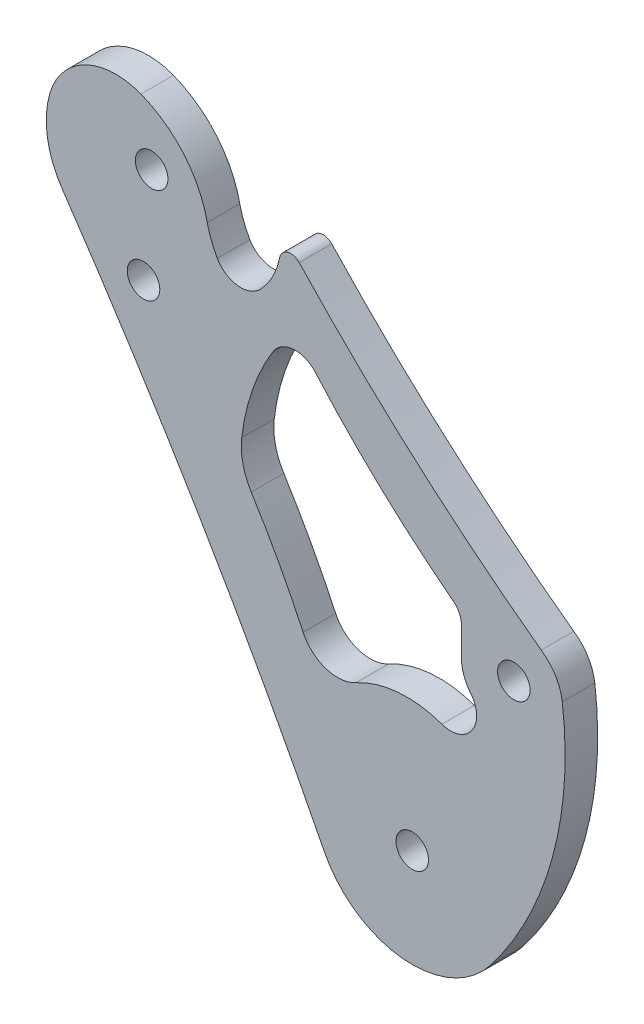
ISO-10303-21;
HEADER;
FILE_DESCRIPTION(('STEP AP214'),'2;1');
FILE_NAME('part.step','',(''),(''),'','','');
FILE_SCHEMA(('AUTOMOTIVE_DESIGN { 1 0 10303 214 1 1 1 1 }'));
ENDSEC;
DATA;
#1=APPLICATION_CONTEXT('core data for automotive mechanical design processes');
#2=APPLICATION_PROTOCOL_DEFINITION('international standard','automotive_design',2000,#1);
#3=PRODUCT_CONTEXT('',#1,'mechanical');
#4=PRODUCT('Part','Part','',(#3));
#5=PRODUCT_RELATED_PRODUCT_CATEGORY('part','',(#4));
#6=PRODUCT_DEFINITION_FORMATION('','',#4);
#7=PRODUCT_DEFINITION_CONTEXT('part definition',#1,'design');
#8=PRODUCT_DEFINITION('design','',#6,#7);
#9=PRODUCT_DEFINITION_SHAPE('','',#8);
#10=(LENGTH_UNIT() NAMED_UNIT(*) SI_UNIT(.MILLI.,.METRE.));
#11=(NAMED_UNIT(*) PLANE_ANGLE_UNIT() SI_UNIT($,.RADIAN.));
#12=(NAMED_UNIT(*) SI_UNIT($,.STERADIAN.) SOLID_ANGLE_UNIT());
#13=UNCERTAINTY_MEASURE_WITH_UNIT(LENGTH_MEASURE(1.E-05),#10,'distance_accuracy_value','');
#14=(GEOMETRIC_REPRESENTATION_CONTEXT(3) GLOBAL_UNCERTAINTY_ASSIGNED_CONTEXT((#13)) GLOBAL_UNIT_ASSIGNED_CONTEXT((#10,
#11,#12)) REPRESENTATION_CONTEXT('',''));
#15=CARTESIAN_POINT('',(0.,0.,0.));
#16=DIRECTION('',(0.,0.,1.));
#17=DIRECTION('',(1.,0.,0.));
#18=AXIS2_PLACEMENT_3D('',#15,#16,#17);
#19=CARTESIAN_POINT('',(65.9573973429245,54.9204086628335,3.));
#20=DIRECTION('',(0.,0.,-1.));
#21=DIRECTION('',(-1.,0.,0.));
#22=AXIS2_PLACEMENT_3D('',#19,#20,#21);
#23=PLANE('',#22);
#24=CARTESIAN_POINT('',(67.5354671080567,46.360427952564,3.));
#25=DIRECTION('',(0.,0.,1.));
#26=DIRECTION('',(1.,0.,0.));
#27=AXIS2_PLACEMENT_3D('',#24,#25,#26);
#28=CIRCLE('',#27,1.50110642000384);
#29=CARTESIAN_POINT('',(69.0365735280606,46.360427952564,3.));
#30=VERTEX_POINT('',#29);
#31=EDGE_CURVE('E282',#30,#30,#28,.T.);
#32=ORIENTED_EDGE('',*,*,#31,.F.);
#33=EDGE_LOOP('',(#32));
#34=FACE_BOUND('',#33,.T.);
#35=CARTESIAN_POINT('',(92.3123714532048,13.2000942948942,3.));
#36=DIRECTION('',(0.,0.,1.));
#37=DIRECTION('',(1.,0.,0.));
#38=AXIS2_PLACEMENT_3D('',#35,#36,#37);
#39=CIRCLE('',#38,1.5);
#40=CARTESIAN_POINT('',(93.8123714532048,13.2000942948942,3.));
#41=VERTEX_POINT('',#40);
#42=EDGE_CURVE('E288',#41,#41,#39,.T.);
#43=ORIENTED_EDGE('',*,*,#42,.F.);
#44=EDGE_LOOP('',(#43));
#45=FACE_BOUND('',#44,.T.);
#46=CARTESIAN_POINT('',(101.682075095834,31.4335430539551,3.));
#47=DIRECTION('',(0.,0.,1.));
#48=DIRECTION('',(1.,0.,0.));
#49=AXIS2_PLACEMENT_3D('',#46,#47,#48);
#50=CIRCLE('',#49,1.5);
#51=CARTESIAN_POINT('',(103.182075095834,31.4335430539551,3.));
#52=VERTEX_POINT('',#51);
#53=EDGE_CURVE('E294',#52,#52,#50,.T.);
#54=ORIENTED_EDGE('',*,*,#53,.F.);
#55=EDGE_LOOP('',(#54));
#56=FACE_BOUND('',#55,.T.);
#57=CARTESIAN_POINT('',(68.2854671080567,55.560427952564,3.));
#58=DIRECTION('',(0.,0.,1.));
#59=DIRECTION('',(1.,0.,0.));
#60=AXIS2_PLACEMENT_3D('',#57,#58,#59);
#61=CIRCLE('',#60,1.5);
#62=CARTESIAN_POINT('',(69.7854671080567,55.560427952564,3.));
#63=VERTEX_POINT('',#62);
#64=EDGE_CURVE('E300',#63,#63,#61,.T.);
#65=ORIENTED_EDGE('',*,*,#64,.F.);
#66=EDGE_LOOP('',(#65));
#67=FACE_BOUND('',#66,.T.);
#68=CARTESIAN_POINT('',(66.9297595318174,54.6414005412217,3.));
#69=DIRECTION('',(0.,0.,1.));
#70=DIRECTION('',(-1.,0.,0.));
#71=AXIS2_PLACEMENT_3D('',#68,#69,#70);
#72=CIRCLE('',#71,8.36216252942286);
#73=CARTESIAN_POINT('',(58.8919443420734,56.9477589574275,3.));
#74=VERTEX_POINT('',#73);
#75=CARTESIAN_POINT('',(60.0269446482824,49.9215585044443,3.));
#76=VERTEX_POINT('',#75);
#77=EDGE_CURVE('E306',#74,#76,#72,.T.);
#78=ORIENTED_EDGE('',*,*,#77,.T.);
#79=CARTESIAN_POINT('',(-239.950657402607,-155.189967755456,3.));
#80=DIRECTION('',(0.,0.,-1.));
#81=DIRECTION('',(-1.,0.,0.));
#82=AXIS2_PLACEMENT_3D('',#79,#80,#81);
#83=CIRCLE('',#82,363.396890378643);
#84=CARTESIAN_POINT('',(84.1952739936411,9.086369847153,3.));
#85=VERTEX_POINT('',#84);
#86=EDGE_CURVE('E309',#76,#85,#83,.T.);
#87=ORIENTED_EDGE('',*,*,#86,.T.);
#88=CARTESIAN_POINT('',(92.3123714532048,13.2000942948942,3.));
#89=DIRECTION('',(0.,0.,1.));
#90=DIRECTION('',(1.,0.,0.));
#91=AXIS2_PLACEMENT_3D('',#88,#89,#90);
#92=CIRCLE('',#91,9.09999999999997);
#93=CARTESIAN_POINT('',(99.5090678289681,7.63075310629086,3.));
#94=VERTEX_POINT('',#93);
#95=EDGE_CURVE('E312',#85,#94,#92,.T.);
#96=ORIENTED_EDGE('',*,*,#95,.T.);
#97=CARTESIAN_POINT('',(73.4111578948811,27.8272651089185,3.));
#98=DIRECTION('',(0.,0.,1.));
#99=DIRECTION('',(1.,0.,0.));
#100=AXIS2_PLACEMENT_3D('',#97,#98,#99);
#101=CIRCLE('',#100,33.);
#102=CARTESIAN_POINT('',(106.145904127564,32.0029553610661,3.));
#103=VERTEX_POINT('',#102);
#104=EDGE_CURVE('E314',#94,#103,#101,.T.);
#105=ORIENTED_EDGE('',*,*,#104,.T.);
#106=CARTESIAN_POINT('',(101.682075095834,31.4335430539551,3.));
#107=DIRECTION('',(0.,0.,1.));
#108=DIRECTION('',(1.,0.,0.));
#109=AXIS2_PLACEMENT_3D('',#106,#107,#108);
#110=CIRCLE('',#109,4.49999999999999);
#111=CARTESIAN_POINT('',(104.210334732775,35.1561635299391,3.));
#112=VERTEX_POINT('',#111);
#113=EDGE_CURVE('E316',#103,#112,#110,.T.);
#114=ORIENTED_EDGE('',*,*,#113,.T.);
#115=CARTESIAN_POINT('',(199.067313338011,164.628673960799,3.));
#116=DIRECTION('',(0.,0.,-1.));
#117=DIRECTION('',(1.,0.,0.));
#118=AXIS2_PLACEMENT_3D('',#115,#116,#117);
#119=CIRCLE('',#118,160.502265863704);
#120=CARTESIAN_POINT('',(81.8891880193831,54.9461124745023,3.));
#121=VERTEX_POINT('',#120);
#122=EDGE_CURVE('E318',#112,#121,#119,.T.);
#123=ORIENTED_EDGE('',*,*,#122,.T.);
#124=CARTESIAN_POINT('',(81.1196021658387,54.2257549208134,3.));
#125=DIRECTION('',(0.,0.,1.));
#126=DIRECTION('',(-1.,0.,0.));
#127=AXIS2_PLACEMENT_3D('',#124,#125,#126);
#128=CIRCLE('',#127,1.05412399229522);
#129=CARTESIAN_POINT('',(80.0854515846548,54.4299851011725,3.));
#130=VERTEX_POINT('',#129);
#131=EDGE_CURVE('E320',#121,#130,#128,.T.);
#132=ORIENTED_EDGE('',*,*,#131,.T.);
#133=CARTESIAN_POINT('',(73.4029266984942,55.7496896853854,3.));
#134=DIRECTION('',(0.,0.,-1.));
#135=DIRECTION('',(1.,0.,0.));
#136=AXIS2_PLACEMENT_3D('',#133,#134,#135);
#137=CIRCLE('',#136,6.81159005253174);
#138=CARTESIAN_POINT('',(78.3014947298892,51.016636729254,3.));
#139=VERTEX_POINT('',#138);
#140=EDGE_CURVE('E322',#130,#139,#137,.T.);
#141=ORIENTED_EDGE('',*,*,#140,.T.);
#142=CARTESIAN_POINT('',(76.5036149420508,52.7537689258592,3.));
#143=DIRECTION('',(0.,0.,-1.));
#144=DIRECTION('',(1.,0.,0.));
#145=AXIS2_PLACEMENT_3D('',#142,#143,#144);
#146=CIRCLE('',#145,2.49999999999999);
#147=CARTESIAN_POINT('',(74.3377170480334,51.5052152375098,3.));
#148=VERTEX_POINT('',#147);
#149=EDGE_CURVE('E324',#139,#148,#146,.T.);
#150=ORIENTED_EDGE('',*,*,#149,.T.);
#151=CARTESIAN_POINT('',(81.5329294190427,55.6529679866559,3.));
#152=DIRECTION('',(0.,0.,-1.));
#153=DIRECTION('',(1.,0.,0.));
#154=AXIS2_PLACEMENT_3D('',#151,#152,#153);
#155=CIRCLE('',#154,8.30511492587398);
#156=CARTESIAN_POINT('',(73.4129652285897,53.9090885533994,3.));
#157=VERTEX_POINT('',#156);
#158=EDGE_CURVE('E326',#148,#157,#155,.T.);
#159=ORIENTED_EDGE('',*,*,#158,.T.);
#160=CARTESIAN_POINT('',(63.6629777816389,51.8151381141552,3.));
#161=DIRECTION('',(0.,0.,1.));
#162=DIRECTION('',(-1.,0.,0.));
#163=AXIS2_PLACEMENT_3D('',#160,#161,#162);
#164=CIRCLE('',#163,9.97230583454543);
#165=CARTESIAN_POINT('',(67.2915815817182,61.1038472881879,3.));
#166=VERTEX_POINT('',#165);
#167=EDGE_CURVE('E328',#157,#166,#164,.T.);
#168=ORIENTED_EDGE('',*,*,#167,.T.);
#169=CARTESIAN_POINT('',(64.9850351540316,55.1994167844453,3.));
#170=DIRECTION('',(0.,0.,1.));
#171=DIRECTION('',(-1.,0.,0.));
#172=AXIS2_PLACEMENT_3D('',#169,#170,#171);
#173=CIRCLE('',#172,6.33896332191618);
#174=EDGE_CURVE('E330',#166,#74,#173,.T.);
#175=ORIENTED_EDGE('',*,*,#174,.T.);
#176=EDGE_LOOP('',(#78,#87,#96,#105,#114,#123,#132,#141,#150,#159,#168,#175));
#177=FACE_BOUND('',#176,.T.);
#178=CARTESIAN_POINT('',(82.6003377734058,37.6113987415421,3.));
#179=DIRECTION('',(0.,0.,1.));
#180=DIRECTION('',(1.,0.,0.));
#181=AXIS2_PLACEMENT_3D('',#178,#179,#180);
#182=CIRCLE('',#181,6.04988415179236);
#183=CARTESIAN_POINT('',(76.5917089679829,38.3167200362377,3.));
#184=VERTEX_POINT('',#183);
#185=CARTESIAN_POINT('',(77.4671539045136,34.4095989947975,3.));
#186=VERTEX_POINT('',#185);
#187=EDGE_CURVE('E196',#184,#186,#182,.T.);
#188=ORIENTED_EDGE('',*,*,#187,.F.);
#189=CARTESIAN_POINT('',(96.9243505215598,35.9299783136989,3.));
#190=DIRECTION('',(0.,0.,1.));
#191=DIRECTION('',(1.,0.,0.));
#192=AXIS2_PLACEMENT_3D('',#189,#190,#191);
#193=CIRCLE('',#192,20.4722458122296);
#194=CARTESIAN_POINT('',(79.4458109725354,46.5889418575684,3.));
#195=VERTEX_POINT('',#194);
#196=EDGE_CURVE('E235',#195,#184,#193,.T.);
#197=ORIENTED_EDGE('',*,*,#196,.F.);
#198=CARTESIAN_POINT('',(81.5347627293735,45.315033327706,3.));
#199=DIRECTION('',(0.,0.,1.));
#200=DIRECTION('',(1.,0.,0.));
#201=AXIS2_PLACEMENT_3D('',#198,#199,#200);
#202=CIRCLE('',#201,2.44674526358041);
#203=CARTESIAN_POINT('',(83.3729221409373,46.9298808011637,3.));
#204=VERTEX_POINT('',#203);
#205=EDGE_CURVE('E233',#204,#195,#202,.T.);
#206=ORIENTED_EDGE('',*,*,#205,.F.);
#207=CARTESIAN_POINT('',(150.51265424025,105.913027783483,3.));
#208=DIRECTION('',(0.,0.,-1.));
#209=DIRECTION('',(-1.,0.,0.));
#210=AXIS2_PLACEMENT_3D('',#207,#208,#209);
#211=CIRCLE('',#210,89.3686480501152);
#212=CARTESIAN_POINT('',(96.0817946008957,35.0325877931282,3.));
#213=VERTEX_POINT('',#212);
#214=EDGE_CURVE('E231',#213,#204,#211,.T.);
#215=ORIENTED_EDGE('',*,*,#214,.F.);
#216=CARTESIAN_POINT('',(94.8854159392447,33.4746508710447,3.));
#217=DIRECTION('',(0.,0.,1.));
#218=DIRECTION('',(1.,0.,0.));
#219=AXIS2_PLACEMENT_3D('',#216,#217,#218);
#220=CIRCLE('',#219,1.9643037838493);
#221=CARTESIAN_POINT('',(96.849719723094,33.4746508710447,3.));
#222=VERTEX_POINT('',#221);
#223=EDGE_CURVE('E229',#222,#213,#220,.T.);
#224=ORIENTED_EDGE('',*,*,#223,.F.);
#225=DIRECTION('',(0.,1.,0.));
#226=VECTOR('',#225,1.);
#227=CARTESIAN_POINT('',(96.849719723094,30.8489992327096,3.));
#228=LINE('',#227,#226);
#229=CARTESIAN_POINT('',(96.849719723094,30.8489992327096,3.));
#230=VERTEX_POINT('',#229);
#231=EDGE_CURVE('E227',#230,#222,#228,.T.);
#232=ORIENTED_EDGE('',*,*,#231,.F.);
#233=CARTESIAN_POINT('',(100.644803888709,30.8489992327096,3.));
#234=DIRECTION('',(0.,0.,-1.));
#235=DIRECTION('',(-1.,0.,0.));
#236=AXIS2_PLACEMENT_3D('',#233,#234,#235);
#237=CIRCLE('',#236,3.79508416561466);
#238=CARTESIAN_POINT('',(97.7092386530645,28.4437714739773,3.));
#239=VERTEX_POINT('',#238);
#240=EDGE_CURVE('E225',#239,#230,#237,.T.);
#241=ORIENTED_EDGE('',*,*,#240,.F.);
#242=CARTESIAN_POINT('',(95.8535239103705,26.9233090576697,3.));
#243=DIRECTION('',(0.,0.,1.));
#244=DIRECTION('',(1.,0.,0.));
#245=AXIS2_PLACEMENT_3D('',#242,#243,#244);
#246=CIRCLE('',#245,2.39905880829459);
#247=CARTESIAN_POINT('',(95.0511730238912,24.6623985727938,3.));
#248=VERTEX_POINT('',#247);
#249=EDGE_CURVE('E223',#248,#239,#246,.T.);
#250=ORIENTED_EDGE('',*,*,#249,.F.);
#251=CARTESIAN_POINT('',(91.8101069202838,15.5295360567749,3.));
#252=DIRECTION('',(0.,0.,-1.));
#253=DIRECTION('',(-1.,0.,0.));
#254=AXIS2_PLACEMENT_3D('',#251,#252,#253);
#255=CIRCLE('',#254,9.69090745103137);
#256=CARTESIAN_POINT('',(87.1342363780843,24.0177585972745,3.));
#257=VERTEX_POINT('',#256);
#258=EDGE_CURVE('E219',#257,#248,#255,.T.);
#259=ORIENTED_EDGE('',*,*,#258,.F.);
#260=CARTESIAN_POINT('',(85.4377471522733,27.0974371205104,3.));
#261=DIRECTION('',(0.,0.,1.));
#262=DIRECTION('',(1.,0.,0.));
#263=AXIS2_PLACEMENT_3D('',#260,#261,#262);
#264=CIRCLE('',#263,3.51603405839208);
#265=CARTESIAN_POINT('',(82.254048976086,25.6052704332014,3.));
#266=VERTEX_POINT('',#265);
#267=EDGE_CURVE('E217',#266,#257,#264,.T.);
#268=ORIENTED_EDGE('',*,*,#267,.F.);
#269=CARTESIAN_POINT('',(6.21597439059316,-10.0329953773693,3.));
#270=DIRECTION('',(0.,0.,-1.));
#271=DIRECTION('',(-1.,0.,0.));
#272=AXIS2_PLACEMENT_3D('',#269,#270,#271);
#273=CIRCLE('',#272,83.9754415091333);
#274=EDGE_CURVE('E204',#186,#266,#273,.T.);
#275=ORIENTED_EDGE('',*,*,#274,.F.);
#276=EDGE_LOOP('',(#188,#197,#206,#215,#224,#232,#241,#250,#259,#268,#275));
#277=FACE_BOUND('',#276,.T.);
#278=ADVANCED_FACE('F41',(#34,#45,#56,#67,#177,#277),#23,.F.);
#279=CARTESIAN_POINT('',(65.9573973429245,54.9204086628335,0.));
#280=DIRECTION('',(0.,0.,-1.));
#281=DIRECTION('',(-1.,0.,0.));
#282=AXIS2_PLACEMENT_3D('',#279,#280,#281);
#283=PLANE('',#282);
#284=CARTESIAN_POINT('',(92.3123714532048,13.2000942948942,0.));
#285=DIRECTION('',(0.,0.,1.));
#286=DIRECTION('',(1.,0.,0.));
#287=AXIS2_PLACEMENT_3D('',#284,#285,#286);
#288=CIRCLE('',#287,1.5);
#289=CARTESIAN_POINT('',(93.8123714532048,13.2000942948942,0.));
#290=VERTEX_POINT('',#289);
#291=EDGE_CURVE('E285',#290,#290,#288,.T.);
#292=ORIENTED_EDGE('',*,*,#291,.T.);
#293=EDGE_LOOP('',(#292));
#294=FACE_BOUND('',#293,.T.);
#295=CARTESIAN_POINT('',(68.2854671080567,55.560427952564,0.));
#296=DIRECTION('',(0.,0.,1.));
#297=DIRECTION('',(1.,0.,0.));
#298=AXIS2_PLACEMENT_3D('',#295,#296,#297);
#299=CIRCLE('',#298,1.5);
#300=CARTESIAN_POINT('',(69.7854671080567,55.560427952564,0.));
#301=VERTEX_POINT('',#300);
#302=EDGE_CURVE('E297',#301,#301,#299,.T.);
#303=ORIENTED_EDGE('',*,*,#302,.T.);
#304=EDGE_LOOP('',(#303));
#305=FACE_BOUND('',#304,.T.);
#306=CARTESIAN_POINT('',(66.9297595318174,54.6414005412217,0.));
#307=DIRECTION('',(0.,0.,1.));
#308=DIRECTION('',(-1.,0.,0.));
#309=AXIS2_PLACEMENT_3D('',#306,#307,#308);
#310=CIRCLE('',#309,8.36216252942286);
#311=CARTESIAN_POINT('',(58.8919443420734,56.9477589574275,0.));
#312=VERTEX_POINT('',#311);
#313=CARTESIAN_POINT('',(60.0269446482824,49.9215585044443,0.));
#314=VERTEX_POINT('',#313);
#315=EDGE_CURVE('E303',#312,#314,#310,.T.);
#316=ORIENTED_EDGE('',*,*,#315,.F.);
#317=CARTESIAN_POINT('',(64.9850351540316,55.1994167844453,0.));
#318=DIRECTION('',(0.,0.,1.));
#319=DIRECTION('',(-1.,0.,0.));
#320=AXIS2_PLACEMENT_3D('',#317,#318,#319);
#321=CIRCLE('',#320,6.33896332191618);
#322=CARTESIAN_POINT('',(67.2915815817182,61.1038472881879,0.));
#323=VERTEX_POINT('',#322);
#324=EDGE_CURVE('E310',#323,#312,#321,.T.);
#325=ORIENTED_EDGE('',*,*,#324,.F.);
#326=CARTESIAN_POINT('',(63.6629777816389,51.8151381141552,0.));
#327=DIRECTION('',(0.,0.,1.));
#328=DIRECTION('',(-1.,0.,0.));
#329=AXIS2_PLACEMENT_3D('',#326,#327,#328);
#330=CIRCLE('',#329,9.97230583454543);
#331=CARTESIAN_POINT('',(73.4129652285897,53.9090885533994,0.));
#332=VERTEX_POINT('',#331);
#333=EDGE_CURVE('E353',#332,#323,#330,.T.);
#334=ORIENTED_EDGE('',*,*,#333,.F.);
#335=CARTESIAN_POINT('',(81.5329294190427,55.6529679866559,0.));
#336=DIRECTION('',(0.,0.,-1.));
#337=DIRECTION('',(1.,0.,0.));
#338=AXIS2_PLACEMENT_3D('',#335,#336,#337);
#339=CIRCLE('',#338,8.30511492587398);
#340=CARTESIAN_POINT('',(74.3377170480334,51.5052152375098,0.));
#341=VERTEX_POINT('',#340);
#342=EDGE_CURVE('E351',#341,#332,#339,.T.);
#343=ORIENTED_EDGE('',*,*,#342,.F.);
#344=CARTESIAN_POINT('',(76.5036149420508,52.7537689258592,0.));
#345=DIRECTION('',(0.,0.,-1.));
#346=DIRECTION('',(1.,0.,0.));
#347=AXIS2_PLACEMENT_3D('',#344,#345,#346);
#348=CIRCLE('',#347,2.49999999999999);
#349=CARTESIAN_POINT('',(78.3014947298892,51.016636729254,0.));
#350=VERTEX_POINT('',#349);
#351=EDGE_CURVE('E349',#350,#341,#348,.T.);
#352=ORIENTED_EDGE('',*,*,#351,.F.);
#353=CARTESIAN_POINT('',(73.4029266984942,55.7496896853854,0.));
#354=DIRECTION('',(0.,0.,-1.));
#355=DIRECTION('',(1.,0.,0.));
#356=AXIS2_PLACEMENT_3D('',#353,#354,#355);
#357=CIRCLE('',#356,6.81159005253174);
#358=CARTESIAN_POINT('',(80.0854515846548,54.4299851011725,0.));
#359=VERTEX_POINT('',#358);
#360=EDGE_CURVE('E347',#359,#350,#357,.T.);
#361=ORIENTED_EDGE('',*,*,#360,.F.);
#362=CARTESIAN_POINT('',(81.1196021658387,54.2257549208134,0.));
#363=DIRECTION('',(0.,0.,1.));
#364=DIRECTION('',(-1.,0.,0.));
#365=AXIS2_PLACEMENT_3D('',#362,#363,#364);
#366=CIRCLE('',#365,1.05412399229522);
#367=CARTESIAN_POINT('',(81.8891880193831,54.9461124745023,0.));
#368=VERTEX_POINT('',#367);
#369=EDGE_CURVE('E345',#368,#359,#366,.T.);
#370=ORIENTED_EDGE('',*,*,#369,.F.);
#371=CARTESIAN_POINT('',(199.067313338011,164.628673960799,0.));
#372=DIRECTION('',(0.,0.,-1.));
#373=DIRECTION('',(1.,0.,0.));
#374=AXIS2_PLACEMENT_3D('',#371,#372,#373);
#375=CIRCLE('',#374,160.502265863704);
#376=CARTESIAN_POINT('',(104.210334732775,35.1561635299391,0.));
#377=VERTEX_POINT('',#376);
#378=EDGE_CURVE('E343',#377,#368,#375,.T.);
#379=ORIENTED_EDGE('',*,*,#378,.F.);
#380=CARTESIAN_POINT('',(101.682075095834,31.4335430539551,0.));
#381=DIRECTION('',(0.,0.,1.));
#382=DIRECTION('',(1.,0.,0.));
#383=AXIS2_PLACEMENT_3D('',#380,#381,#382);
#384=CIRCLE('',#383,4.49999999999999);
#385=CARTESIAN_POINT('',(106.145904127564,32.0029553610661,0.));
#386=VERTEX_POINT('',#385);
#387=EDGE_CURVE('E341',#386,#377,#384,.T.);
#388=ORIENTED_EDGE('',*,*,#387,.F.);
#389=CARTESIAN_POINT('',(73.4111578948811,27.8272651089185,0.));
#390=DIRECTION('',(0.,0.,1.));
#391=DIRECTION('',(1.,0.,0.));
#392=AXIS2_PLACEMENT_3D('',#389,#390,#391);
#393=CIRCLE('',#392,33.);
#394=CARTESIAN_POINT('',(99.5090678289681,7.63075310629086,0.));
#395=VERTEX_POINT('',#394);
#396=EDGE_CURVE('E339',#395,#386,#393,.T.);
#397=ORIENTED_EDGE('',*,*,#396,.F.);
#398=CARTESIAN_POINT('',(92.3123714532048,13.2000942948942,0.));
#399=DIRECTION('',(0.,0.,1.));
#400=DIRECTION('',(1.,0.,0.));
#401=AXIS2_PLACEMENT_3D('',#398,#399,#400);
#402=CIRCLE('',#401,9.09999999999997);
#403=CARTESIAN_POINT('',(84.1952739936411,9.086369847153,0.));
#404=VERTEX_POINT('',#403);
#405=EDGE_CURVE('E337',#404,#395,#402,.T.);
#406=ORIENTED_EDGE('',*,*,#405,.F.);
#407=CARTESIAN_POINT('',(-239.950657402607,-155.189967755456,0.));
#408=DIRECTION('',(0.,0.,-1.));
#409=DIRECTION('',(-1.,0.,0.));
#410=AXIS2_PLACEMENT_3D('',#407,#408,#409);
#411=CIRCLE('',#410,363.396890378643);
#412=EDGE_CURVE('E335',#314,#404,#411,.T.);
#413=ORIENTED_EDGE('',*,*,#412,.F.);
#414=EDGE_LOOP('',(#316,#325,#334,#343,#352,#361,#370,#379,#388,#397,#406,#413));
#415=FACE_BOUND('',#414,.T.);
#416=CARTESIAN_POINT('',(101.682075095834,31.4335430539551,0.));
#417=DIRECTION('',(0.,0.,1.));
#418=DIRECTION('',(1.,0.,0.));
#419=AXIS2_PLACEMENT_3D('',#416,#417,#418);
#420=CIRCLE('',#419,1.5);
#421=CARTESIAN_POINT('',(103.182075095834,31.4335430539551,0.));
#422=VERTEX_POINT('',#421);
#423=EDGE_CURVE('E291',#422,#422,#420,.T.);
#424=ORIENTED_EDGE('',*,*,#423,.T.);
#425=EDGE_LOOP('',(#424));
#426=FACE_BOUND('',#425,.T.);
#427=CARTESIAN_POINT('',(67.5354671080567,46.360427952564,0.));
#428=DIRECTION('',(0.,0.,1.));
#429=DIRECTION('',(1.,0.,0.));
#430=AXIS2_PLACEMENT_3D('',#427,#428,#429);
#431=CIRCLE('',#430,1.50110642000384);
#432=CARTESIAN_POINT('',(69.0365735280606,46.360427952564,0.));
#433=VERTEX_POINT('',#432);
#434=EDGE_CURVE('E212',#433,#433,#431,.T.);
#435=ORIENTED_EDGE('',*,*,#434,.T.);
#436=EDGE_LOOP('',(#435));
#437=FACE_BOUND('',#436,.T.);
#438=CARTESIAN_POINT('',(96.9243505215598,35.9299783136989,0.));
#439=DIRECTION('',(0.,0.,1.));
#440=DIRECTION('',(1.,0.,0.));
#441=AXIS2_PLACEMENT_3D('',#438,#439,#440);
#442=CIRCLE('',#441,20.4722458122296);
#443=CARTESIAN_POINT('',(79.4458109725354,46.5889418575684,0.));
#444=VERTEX_POINT('',#443);
#445=CARTESIAN_POINT('',(76.5917089679829,38.3167200362377,0.));
#446=VERTEX_POINT('',#445);
#447=EDGE_CURVE('E205',#444,#446,#442,.T.);
#448=ORIENTED_EDGE('',*,*,#447,.T.);
#449=CARTESIAN_POINT('',(82.6003377734058,37.6113987415421,0.));
#450=DIRECTION('',(0.,0.,1.));
#451=DIRECTION('',(1.,0.,0.));
#452=AXIS2_PLACEMENT_3D('',#449,#450,#451);
#453=CIRCLE('',#452,6.04988415179236);
#454=CARTESIAN_POINT('',(77.4671539045136,34.4095989947975,0.));
#455=VERTEX_POINT('',#454);
#456=EDGE_CURVE('E64',#446,#455,#453,.T.);
#457=ORIENTED_EDGE('',*,*,#456,.T.);
#458=CARTESIAN_POINT('',(6.21597439059316,-10.0329953773693,0.));
#459=DIRECTION('',(0.,0.,-1.));
#460=DIRECTION('',(-1.,0.,0.));
#461=AXIS2_PLACEMENT_3D('',#458,#459,#460);
#462=CIRCLE('',#461,83.9754415091333);
#463=CARTESIAN_POINT('',(82.254048976086,25.6052704332014,0.));
#464=VERTEX_POINT('',#463);
#465=EDGE_CURVE('E211',#455,#464,#462,.T.);
#466=ORIENTED_EDGE('',*,*,#465,.T.);
#467=CARTESIAN_POINT('',(85.4377471522733,27.0974371205104,0.));
#468=DIRECTION('',(0.,0.,1.));
#469=DIRECTION('',(1.,0.,0.));
#470=AXIS2_PLACEMENT_3D('',#467,#468,#469);
#471=CIRCLE('',#470,3.51603405839208);
#472=CARTESIAN_POINT('',(87.1342363780843,24.0177585972745,0.));
#473=VERTEX_POINT('',#472);
#474=EDGE_CURVE('E239',#464,#473,#471,.T.);
#475=ORIENTED_EDGE('',*,*,#474,.T.);
#476=CARTESIAN_POINT('',(91.8101069202838,15.5295360567749,0.));
#477=DIRECTION('',(0.,0.,-1.));
#478=DIRECTION('',(-1.,0.,0.));
#479=AXIS2_PLACEMENT_3D('',#476,#477,#478);
#480=CIRCLE('',#479,9.69090745103137);
#481=CARTESIAN_POINT('',(95.0511730238912,24.6623985727938,0.));
#482=VERTEX_POINT('',#481);
#483=EDGE_CURVE('E242',#473,#482,#480,.T.);
#484=ORIENTED_EDGE('',*,*,#483,.T.);
#485=CARTESIAN_POINT('',(95.8535239103705,26.9233090576697,0.));
#486=DIRECTION('',(0.,0.,1.));
#487=DIRECTION('',(1.,0.,0.));
#488=AXIS2_PLACEMENT_3D('',#485,#486,#487);
#489=CIRCLE('',#488,2.39905880829459);
#490=CARTESIAN_POINT('',(97.7092386530645,28.4437714739773,0.));
#491=VERTEX_POINT('',#490);
#492=EDGE_CURVE('E245',#482,#491,#489,.T.);
#493=ORIENTED_EDGE('',*,*,#492,.T.);
#494=CARTESIAN_POINT('',(100.644803888709,30.8489992327096,0.));
#495=DIRECTION('',(0.,0.,-1.));
#496=DIRECTION('',(-1.,0.,0.));
#497=AXIS2_PLACEMENT_3D('',#494,#495,#496);
#498=CIRCLE('',#497,3.79508416561466);
#499=CARTESIAN_POINT('',(96.849719723094,30.8489992327096,0.));
#500=VERTEX_POINT('',#499);
#501=EDGE_CURVE('E248',#491,#500,#498,.T.);
#502=ORIENTED_EDGE('',*,*,#501,.T.);
#503=DIRECTION('',(0.,1.,0.));
#504=VECTOR('',#503,1.);
#505=CARTESIAN_POINT('',(96.849719723094,30.8489992327096,0.));
#506=LINE('',#505,#504);
#507=CARTESIAN_POINT('',(96.849719723094,33.4746508710447,0.));
#508=VERTEX_POINT('',#507);
#509=EDGE_CURVE('E251',#500,#508,#506,.T.);
#510=ORIENTED_EDGE('',*,*,#509,.T.);
#511=CARTESIAN_POINT('',(94.8854159392447,33.4746508710447,0.));
#512=DIRECTION('',(0.,0.,1.));
#513=DIRECTION('',(1.,0.,0.));
#514=AXIS2_PLACEMENT_3D('',#511,#512,#513);
#515=CIRCLE('',#514,1.9643037838493);
#516=CARTESIAN_POINT('',(96.0817946008957,35.0325877931282,0.));
#517=VERTEX_POINT('',#516);
#518=EDGE_CURVE('E254',#508,#517,#515,.T.);
#519=ORIENTED_EDGE('',*,*,#518,.T.);
#520=CARTESIAN_POINT('',(150.51265424025,105.913027783483,0.));
#521=DIRECTION('',(0.,0.,-1.));
#522=DIRECTION('',(-1.,0.,0.));
#523=AXIS2_PLACEMENT_3D('',#520,#521,#522);
#524=CIRCLE('',#523,89.3686480501152);
#525=CARTESIAN_POINT('',(83.3729221409373,46.9298808011637,0.));
#526=VERTEX_POINT('',#525);
#527=EDGE_CURVE('E257',#517,#526,#524,.T.);
#528=ORIENTED_EDGE('',*,*,#527,.T.);
#529=CARTESIAN_POINT('',(81.5347627293735,45.315033327706,0.));
#530=DIRECTION('',(0.,0.,1.));
#531=DIRECTION('',(1.,0.,0.));
#532=AXIS2_PLACEMENT_3D('',#529,#530,#531);
#533=CIRCLE('',#532,2.44674526358041);
#534=EDGE_CURVE('E260',#526,#444,#533,.T.);
#535=ORIENTED_EDGE('',*,*,#534,.T.);
#536=EDGE_LOOP('',(#448,#457,#466,#475,#484,#493,#502,#510,#519,#528,#535));
#537=FACE_BOUND('',#536,.T.);
#538=ADVANCED_FACE('F395',(#294,#305,#415,#426,#437,#537),#283,.T.);
#539=CARTESIAN_POINT('',(66.9297595318174,54.6414005412217,3.));
#540=DIRECTION('',(0.,0.,-1.));
#541=DIRECTION('',(-1.,0.,0.));
#542=AXIS2_PLACEMENT_3D('',#539,#540,#541);
#543=CYLINDRICAL_SURFACE('',#542,8.36216252942286);
#544=ORIENTED_EDGE('',*,*,#315,.T.);
#545=DIRECTION('',(0.,0.,-1.));
#546=VECTOR('',#545,1.);
#547=CARTESIAN_POINT('',(60.0269446482824,49.9215585044443,3.));
#548=LINE('',#547,#546);
#549=EDGE_CURVE('E11',#76,#314,#548,.T.);
#550=ORIENTED_EDGE('',*,*,#549,.F.);
#551=ORIENTED_EDGE('',*,*,#77,.F.);
#552=DIRECTION('',(0.,0.,-1.));
#553=VECTOR('',#552,1.);
#554=CARTESIAN_POINT('',(58.8919443420734,56.9477589574275,3.));
#555=LINE('',#554,#553);
#556=EDGE_CURVE('E332',#74,#312,#555,.T.);
#557=ORIENTED_EDGE('',*,*,#556,.T.);
#558=EDGE_LOOP('',(#544,#550,#551,#557));
#559=FACE_BOUND('',#558,.T.);
#560=ADVANCED_FACE('F43',(#559),#543,.T.);
#561=CARTESIAN_POINT('',(-239.950657402607,-155.189967755456,3.));
#562=DIRECTION('',(0.,0.,-1.));
#563=DIRECTION('',(-1.,0.,0.));
#564=AXIS2_PLACEMENT_3D('',#561,#562,#563);
#565=CYLINDRICAL_SURFACE('',#564,363.396890378643);
#566=ORIENTED_EDGE('',*,*,#412,.T.);
#567=DIRECTION('',(0.,0.,-1.));
#568=VECTOR('',#567,1.);
#569=CARTESIAN_POINT('',(84.1952739936411,9.086369847153,3.));
#570=LINE('',#569,#568);
#571=EDGE_CURVE('E49',#85,#404,#570,.T.);
#572=ORIENTED_EDGE('',*,*,#571,.F.);
#573=ORIENTED_EDGE('',*,*,#86,.F.);
#574=ORIENTED_EDGE('',*,*,#549,.T.);
#575=EDGE_LOOP('',(#566,#572,#573,#574));
#576=FACE_BOUND('',#575,.T.);
#577=ADVANCED_FACE('F412',(#576),#565,.F.);
#578=CARTESIAN_POINT('',(92.3123714532048,13.2000942948942,3.));
#579=DIRECTION('',(0.,0.,-1.));
#580=DIRECTION('',(-1.,0.,0.));
#581=AXIS2_PLACEMENT_3D('',#578,#579,#580);
#582=CYLINDRICAL_SURFACE('',#581,9.09999999999997);
#583=ORIENTED_EDGE('',*,*,#405,.T.);
#584=DIRECTION('',(0.,0.,-1.));
#585=VECTOR('',#584,1.);
#586=CARTESIAN_POINT('',(99.5090678289681,7.63075310629086,3.));
#587=LINE('',#586,#585);
#588=EDGE_CURVE('E382',#94,#395,#587,.T.);
#589=ORIENTED_EDGE('',*,*,#588,.F.);
#590=ORIENTED_EDGE('',*,*,#95,.F.);
#591=ORIENTED_EDGE('',*,*,#571,.T.);
#592=EDGE_LOOP('',(#583,#589,#590,#591));
#593=FACE_BOUND('',#592,.T.);
#594=ADVANCED_FACE('F389',(#593),#582,.T.);
#595=CARTESIAN_POINT('',(73.4111578948811,27.8272651089185,3.));
#596=DIRECTION('',(0.,0.,-1.));
#597=DIRECTION('',(-1.,0.,0.));
#598=AXIS2_PLACEMENT_3D('',#595,#596,#597);
#599=CYLINDRICAL_SURFACE('',#598,33.);
#600=ORIENTED_EDGE('',*,*,#396,.T.);
#601=DIRECTION('',(0.,0.,-1.));
#602=VECTOR('',#601,1.);
#603=CARTESIAN_POINT('',(106.145904127564,32.0029553610661,3.));
#604=LINE('',#603,#602);
#605=EDGE_CURVE('E379',#103,#386,#604,.T.);
#606=ORIENTED_EDGE('',*,*,#605,.F.);
#607=ORIENTED_EDGE('',*,*,#104,.F.);
#608=ORIENTED_EDGE('',*,*,#588,.T.);
#609=EDGE_LOOP('',(#600,#606,#607,#608));
#610=FACE_BOUND('',#609,.T.);
#611=ADVANCED_FACE('F401',(#610),#599,.T.);
#612=CARTESIAN_POINT('',(101.682075095834,31.4335430539551,3.));
#613=DIRECTION('',(0.,0.,-1.));
#614=DIRECTION('',(-1.,0.,0.));
#615=AXIS2_PLACEMENT_3D('',#612,#613,#614);
#616=CYLINDRICAL_SURFACE('',#615,4.49999999999999);
#617=ORIENTED_EDGE('',*,*,#387,.T.);
#618=DIRECTION('',(0.,0.,-1.));
#619=VECTOR('',#618,1.);
#620=CARTESIAN_POINT('',(104.210334732775,35.1561635299391,3.));
#621=LINE('',#620,#619);
#622=EDGE_CURVE('E376',#112,#377,#621,.T.);
#623=ORIENTED_EDGE('',*,*,#622,.F.);
#624=ORIENTED_EDGE('',*,*,#113,.F.);
#625=ORIENTED_EDGE('',*,*,#605,.T.);
#626=EDGE_LOOP('',(#617,#623,#624,#625));
#627=FACE_BOUND('',#626,.T.);
#628=ADVANCED_FACE('F405',(#627),#616,.T.);
#629=CARTESIAN_POINT('',(199.067313338011,164.628673960799,3.));
#630=DIRECTION('',(0.,0.,-1.));
#631=DIRECTION('',(-1.,0.,0.));
#632=AXIS2_PLACEMENT_3D('',#629,#630,#631);
#633=CYLINDRICAL_SURFACE('',#632,160.502265863704);
#634=ORIENTED_EDGE('',*,*,#378,.T.);
#635=DIRECTION('',(0.,0.,-1.));
#636=VECTOR('',#635,1.);
#637=CARTESIAN_POINT('',(81.8891880193831,54.9461124745023,3.));
#638=LINE('',#637,#636);
#639=EDGE_CURVE('E373',#121,#368,#638,.T.);
#640=ORIENTED_EDGE('',*,*,#639,.F.);
#641=ORIENTED_EDGE('',*,*,#122,.F.);
#642=ORIENTED_EDGE('',*,*,#622,.T.);
#643=EDGE_LOOP('',(#634,#640,#641,#642));
#644=FACE_BOUND('',#643,.T.);
#645=ADVANCED_FACE('F445',(#644),#633,.F.);
#646=CARTESIAN_POINT('',(81.1196021658387,54.2257549208134,3.));
#647=DIRECTION('',(0.,0.,-1.));
#648=DIRECTION('',(-1.,0.,0.));
#649=AXIS2_PLACEMENT_3D('',#646,#647,#648);
#650=CYLINDRICAL_SURFACE('',#649,1.05412399229522);
#651=ORIENTED_EDGE('',*,*,#369,.T.);
#652=DIRECTION('',(0.,0.,-1.));
#653=VECTOR('',#652,1.);
#654=CARTESIAN_POINT('',(80.0854515846548,54.4299851011725,3.));
#655=LINE('',#654,#653);
#656=EDGE_CURVE('E370',#130,#359,#655,.T.);
#657=ORIENTED_EDGE('',*,*,#656,.F.);
#658=ORIENTED_EDGE('',*,*,#131,.F.);
#659=ORIENTED_EDGE('',*,*,#639,.T.);
#660=EDGE_LOOP('',(#651,#657,#658,#659));
#661=FACE_BOUND('',#660,.T.);
#662=ADVANCED_FACE('F443',(#661),#650,.T.);
#663=CARTESIAN_POINT('',(73.4029266984942,55.7496896853854,3.));
#664=DIRECTION('',(0.,0.,-1.));
#665=DIRECTION('',(-1.,0.,0.));
#666=AXIS2_PLACEMENT_3D('',#663,#664,#665);
#667=CYLINDRICAL_SURFACE('',#666,6.81159005253174);
#668=ORIENTED_EDGE('',*,*,#360,.T.);
#669=DIRECTION('',(0.,0.,-1.));
#670=VECTOR('',#669,1.);
#671=CARTESIAN_POINT('',(78.3014947298892,51.016636729254,3.));
#672=LINE('',#671,#670);
#673=EDGE_CURVE('E367',#139,#350,#672,.T.);
#674=ORIENTED_EDGE('',*,*,#673,.F.);
#675=ORIENTED_EDGE('',*,*,#140,.F.);
#676=ORIENTED_EDGE('',*,*,#656,.T.);
#677=EDGE_LOOP('',(#668,#674,#675,#676));
#678=FACE_BOUND('',#677,.T.);
#679=ADVANCED_FACE('F439',(#678),#667,.F.);
#680=CARTESIAN_POINT('',(76.5036149420508,52.7537689258592,3.));
#681=DIRECTION('',(0.,0.,-1.));
#682=DIRECTION('',(-1.,0.,0.));
#683=AXIS2_PLACEMENT_3D('',#680,#681,#682);
#684=CYLINDRICAL_SURFACE('',#683,2.49999999999999);
#685=ORIENTED_EDGE('',*,*,#351,.T.);
#686=DIRECTION('',(0.,0.,-1.));
#687=VECTOR('',#686,1.);
#688=CARTESIAN_POINT('',(74.3377170480334,51.5052152375098,3.));
#689=LINE('',#688,#687);
#690=EDGE_CURVE('E364',#148,#341,#689,.T.);
#691=ORIENTED_EDGE('',*,*,#690,.F.);
#692=ORIENTED_EDGE('',*,*,#149,.F.);
#693=ORIENTED_EDGE('',*,*,#673,.T.);
#694=EDGE_LOOP('',(#685,#691,#692,#693));
#695=FACE_BOUND('',#694,.T.);
#696=ADVANCED_FACE('F434',(#695),#684,.F.);
#697=CARTESIAN_POINT('',(81.5329294190427,55.6529679866559,3.));
#698=DIRECTION('',(0.,0.,-1.));
#699=DIRECTION('',(-1.,0.,0.));
#700=AXIS2_PLACEMENT_3D('',#697,#698,#699);
#701=CYLINDRICAL_SURFACE('',#700,8.30511492587398);
#702=ORIENTED_EDGE('',*,*,#342,.T.);
#703=DIRECTION('',(0.,0.,-1.));
#704=VECTOR('',#703,1.);
#705=CARTESIAN_POINT('',(73.4129652285897,53.9090885533994,3.));
#706=LINE('',#705,#704);
#707=EDGE_CURVE('E361',#157,#332,#706,.T.);
#708=ORIENTED_EDGE('',*,*,#707,.F.);
#709=ORIENTED_EDGE('',*,*,#158,.F.);
#710=ORIENTED_EDGE('',*,*,#690,.T.);
#711=EDGE_LOOP('',(#702,#708,#709,#710));
#712=FACE_BOUND('',#711,.T.);
#713=ADVANCED_FACE('F428',(#712),#701,.F.);
#714=CARTESIAN_POINT('',(63.6629777816389,51.8151381141552,3.));
#715=DIRECTION('',(0.,0.,-1.));
#716=DIRECTION('',(-1.,0.,0.));
#717=AXIS2_PLACEMENT_3D('',#714,#715,#716);
#718=CYLINDRICAL_SURFACE('',#717,9.97230583454543);
#719=ORIENTED_EDGE('',*,*,#333,.T.);
#720=DIRECTION('',(0.,0.,-1.));
#721=VECTOR('',#720,1.);
#722=CARTESIAN_POINT('',(67.2915815817182,61.1038472881879,3.));
#723=LINE('',#722,#721);
#724=EDGE_CURVE('E358',#166,#323,#723,.T.);
#725=ORIENTED_EDGE('',*,*,#724,.F.);
#726=ORIENTED_EDGE('',*,*,#167,.F.);
#727=ORIENTED_EDGE('',*,*,#707,.T.);
#728=EDGE_LOOP('',(#719,#725,#726,#727));
#729=FACE_BOUND('',#728,.T.);
#730=ADVANCED_FACE('F424',(#729),#718,.T.);
#731=CARTESIAN_POINT('',(64.9850351540316,55.1994167844453,3.));
#732=DIRECTION('',(0.,0.,-1.));
#733=DIRECTION('',(-1.,0.,0.));
#734=AXIS2_PLACEMENT_3D('',#731,#732,#733);
#735=CYLINDRICAL_SURFACE('',#734,6.33896332191618);
#736=ORIENTED_EDGE('',*,*,#324,.T.);
#737=ORIENTED_EDGE('',*,*,#556,.F.);
#738=ORIENTED_EDGE('',*,*,#174,.F.);
#739=ORIENTED_EDGE('',*,*,#724,.T.);
#740=EDGE_LOOP('',(#736,#737,#738,#739));
#741=FACE_BOUND('',#740,.T.);
#742=ADVANCED_FACE('F419',(#741),#735,.T.);
#743=CARTESIAN_POINT('',(68.2854671080567,55.560427952564,3.));
#744=DIRECTION('',(0.,0.,-1.));
#745=DIRECTION('',(-1.,0.,0.));
#746=AXIS2_PLACEMENT_3D('',#743,#744,#745);
#747=CYLINDRICAL_SURFACE('',#746,1.5);
#748=ORIENTED_EDGE('',*,*,#64,.T.);
#749=EDGE_LOOP('',(#748));
#750=FACE_BOUND('',#749,.T.);
#751=ORIENTED_EDGE('',*,*,#302,.F.);
#752=EDGE_LOOP('',(#751));
#753=FACE_BOUND('',#752,.T.);
#754=ADVANCED_FACE('F465',(#750,#753),#747,.F.);
#755=CARTESIAN_POINT('',(101.682075095834,31.4335430539551,3.));
#756=DIRECTION('',(0.,0.,-1.));
#757=DIRECTION('',(-1.,0.,0.));
#758=AXIS2_PLACEMENT_3D('',#755,#756,#757);
#759=CYLINDRICAL_SURFACE('',#758,1.5);
#760=ORIENTED_EDGE('',*,*,#53,.T.);
#761=EDGE_LOOP('',(#760));
#762=FACE_BOUND('',#761,.T.);
#763=ORIENTED_EDGE('',*,*,#423,.F.);
#764=EDGE_LOOP('',(#763));
#765=FACE_BOUND('',#764,.T.);
#766=ADVANCED_FACE('F508',(#762,#765),#759,.F.);
#767=CARTESIAN_POINT('',(92.3123714532048,13.2000942948942,3.));
#768=DIRECTION('',(0.,0.,-1.));
#769=DIRECTION('',(-1.,0.,0.));
#770=AXIS2_PLACEMENT_3D('',#767,#768,#769);
#771=CYLINDRICAL_SURFACE('',#770,1.5);
#772=ORIENTED_EDGE('',*,*,#42,.T.);
#773=EDGE_LOOP('',(#772));
#774=FACE_BOUND('',#773,.T.);
#775=ORIENTED_EDGE('',*,*,#291,.F.);
#776=EDGE_LOOP('',(#775));
#777=FACE_BOUND('',#776,.T.);
#778=ADVANCED_FACE('F516',(#774,#777),#771,.F.);
#779=CARTESIAN_POINT('',(67.5354671080567,46.360427952564,3.));
#780=DIRECTION('',(0.,0.,-1.));
#781=DIRECTION('',(-1.,0.,0.));
#782=AXIS2_PLACEMENT_3D('',#779,#780,#781);
#783=CYLINDRICAL_SURFACE('',#782,1.50110642000384);
#784=ORIENTED_EDGE('',*,*,#31,.T.);
#785=EDGE_LOOP('',(#784));
#786=FACE_BOUND('',#785,.T.);
#787=ORIENTED_EDGE('',*,*,#434,.F.);
#788=EDGE_LOOP('',(#787));
#789=FACE_BOUND('',#788,.T.);
#790=ADVANCED_FACE('F524',(#786,#789),#783,.F.);
#791=CARTESIAN_POINT('',(82.6003377734058,37.6113987415421,3.));
#792=DIRECTION('',(0.,0.,-1.));
#793=DIRECTION('',(-1.,0.,0.));
#794=AXIS2_PLACEMENT_3D('',#791,#792,#793);
#795=CYLINDRICAL_SURFACE('',#794,6.04988415179236);
#796=ORIENTED_EDGE('',*,*,#456,.F.);
#797=DIRECTION('',(0.,0.,-1.));
#798=VECTOR('',#797,1.);
#799=CARTESIAN_POINT('',(76.5917089679829,38.3167200362377,3.));
#800=LINE('',#799,#798);
#801=EDGE_CURVE('E200',#184,#446,#800,.T.);
#802=ORIENTED_EDGE('',*,*,#801,.F.);
#803=ORIENTED_EDGE('',*,*,#187,.T.);
#804=DIRECTION('',(0.,0.,-1.));
#805=VECTOR('',#804,1.);
#806=CARTESIAN_POINT('',(77.4671539045136,34.4095989947975,3.));
#807=LINE('',#806,#805);
#808=EDGE_CURVE('E199',#186,#455,#807,.T.);
#809=ORIENTED_EDGE('',*,*,#808,.T.);
#810=EDGE_LOOP('',(#796,#802,#803,#809));
#811=FACE_BOUND('',#810,.T.);
#812=ADVANCED_FACE('F198',(#811),#795,.F.);
#813=CARTESIAN_POINT('',(6.21597439059316,-10.0329953773693,3.));
#814=DIRECTION('',(0.,0.,-1.));
#815=DIRECTION('',(-1.,0.,0.));
#816=AXIS2_PLACEMENT_3D('',#813,#814,#815);
#817=CYLINDRICAL_SURFACE('',#816,83.9754415091333);
#818=ORIENTED_EDGE('',*,*,#465,.F.);
#819=ORIENTED_EDGE('',*,*,#808,.F.);
#820=ORIENTED_EDGE('',*,*,#274,.T.);
#821=DIRECTION('',(0.,0.,-1.));
#822=VECTOR('',#821,1.);
#823=CARTESIAN_POINT('',(82.254048976086,25.6052704332014,3.));
#824=LINE('',#823,#822);
#825=EDGE_CURVE('E213',#266,#464,#824,.T.);
#826=ORIENTED_EDGE('',*,*,#825,.T.);
#827=EDGE_LOOP('',(#818,#819,#820,#826));
#828=FACE_BOUND('',#827,.T.);
#829=ADVANCED_FACE('F208',(#828),#817,.T.);
#830=CARTESIAN_POINT('',(85.4377471522733,27.0974371205104,3.));
#831=DIRECTION('',(0.,0.,-1.));
#832=DIRECTION('',(-1.,0.,0.));
#833=AXIS2_PLACEMENT_3D('',#830,#831,#832);
#834=CYLINDRICAL_SURFACE('',#833,3.51603405839208);
#835=ORIENTED_EDGE('',*,*,#474,.F.);
#836=ORIENTED_EDGE('',*,*,#825,.F.);
#837=ORIENTED_EDGE('',*,*,#267,.T.);
#838=DIRECTION('',(0.,0.,-1.));
#839=VECTOR('',#838,1.);
#840=CARTESIAN_POINT('',(87.1342363780843,24.0177585972745,3.));
#841=LINE('',#840,#839);
#842=EDGE_CURVE('E279',#257,#473,#841,.T.);
#843=ORIENTED_EDGE('',*,*,#842,.T.);
#844=EDGE_LOOP('',(#835,#836,#837,#843));
#845=FACE_BOUND('',#844,.T.);
#846=ADVANCED_FACE('F548',(#845),#834,.F.);
#847=CARTESIAN_POINT('',(91.8101069202838,15.5295360567749,3.));
#848=DIRECTION('',(0.,0.,-1.));
#849=DIRECTION('',(-1.,0.,0.));
#850=AXIS2_PLACEMENT_3D('',#847,#848,#849);
#851=CYLINDRICAL_SURFACE('',#850,9.69090745103137);
#852=ORIENTED_EDGE('',*,*,#483,.F.);
#853=ORIENTED_EDGE('',*,*,#842,.F.);
#854=ORIENTED_EDGE('',*,*,#258,.T.);
#855=DIRECTION('',(0.,0.,-1.));
#856=VECTOR('',#855,1.);
#857=CARTESIAN_POINT('',(95.0511730238912,24.6623985727938,3.));
#858=LINE('',#857,#856);
#859=EDGE_CURVE('E277',#248,#482,#858,.T.);
#860=ORIENTED_EDGE('',*,*,#859,.T.);
#861=EDGE_LOOP('',(#852,#853,#854,#860));
#862=FACE_BOUND('',#861,.T.);
#863=ADVANCED_FACE('F556',(#862),#851,.T.);
#864=CARTESIAN_POINT('',(95.8535239103705,26.9233090576697,3.));
#865=DIRECTION('',(0.,0.,-1.));
#866=DIRECTION('',(-1.,0.,0.));
#867=AXIS2_PLACEMENT_3D('',#864,#865,#866);
#868=CYLINDRICAL_SURFACE('',#867,2.39905880829459);
#869=ORIENTED_EDGE('',*,*,#492,.F.);
#870=ORIENTED_EDGE('',*,*,#859,.F.);
#871=ORIENTED_EDGE('',*,*,#249,.T.);
#872=DIRECTION('',(0.,0.,-1.));
#873=VECTOR('',#872,1.);
#874=CARTESIAN_POINT('',(97.7092386530645,28.4437714739773,3.));
#875=LINE('',#874,#873);
#876=EDGE_CURVE('E275',#239,#491,#875,.T.);
#877=ORIENTED_EDGE('',*,*,#876,.T.);
#878=EDGE_LOOP('',(#869,#870,#871,#877));
#879=FACE_BOUND('',#878,.T.);
#880=ADVANCED_FACE('F565',(#879),#868,.F.);
#881=CARTESIAN_POINT('',(100.644803888709,30.8489992327096,3.));
#882=DIRECTION('',(0.,0.,-1.));
#883=DIRECTION('',(-1.,0.,0.));
#884=AXIS2_PLACEMENT_3D('',#881,#882,#883);
#885=CYLINDRICAL_SURFACE('',#884,3.79508416561466);
#886=ORIENTED_EDGE('',*,*,#501,.F.);
#887=ORIENTED_EDGE('',*,*,#876,.F.);
#888=ORIENTED_EDGE('',*,*,#240,.T.);
#889=DIRECTION('',(0.,0.,-1.));
#890=VECTOR('',#889,1.);
#891=CARTESIAN_POINT('',(96.849719723094,30.8489992327096,3.));
#892=LINE('',#891,#890);
#893=EDGE_CURVE('E273',#230,#500,#892,.T.);
#894=ORIENTED_EDGE('',*,*,#893,.T.);
#895=EDGE_LOOP('',(#886,#887,#888,#894));
#896=FACE_BOUND('',#895,.T.);
#897=ADVANCED_FACE('F574',(#896),#885,.T.);
#898=CARTESIAN_POINT('',(96.849719723094,30.8489992327096,3.));
#899=DIRECTION('',(-1.,0.,0.));
#900=DIRECTION('',(0.,0.,1.));
#901=AXIS2_PLACEMENT_3D('',#898,#899,#900);
#902=PLANE('',#901);
#903=ORIENTED_EDGE('',*,*,#509,.F.);
#904=ORIENTED_EDGE('',*,*,#893,.F.);
#905=ORIENTED_EDGE('',*,*,#231,.T.);
#906=DIRECTION('',(0.,0.,-1.));
#907=VECTOR('',#906,1.);
#908=CARTESIAN_POINT('',(96.849719723094,33.4746508710447,3.));
#909=LINE('',#908,#907);
#910=EDGE_CURVE('E271',#222,#508,#909,.T.);
#911=ORIENTED_EDGE('',*,*,#910,.T.);
#912=EDGE_LOOP('',(#903,#904,#905,#911));
#913=FACE_BOUND('',#912,.T.);
#914=ADVANCED_FACE('F583',(#913),#902,.T.);
#915=CARTESIAN_POINT('',(94.8854159392447,33.4746508710447,3.));
#916=DIRECTION('',(0.,0.,-1.));
#917=DIRECTION('',(-1.,0.,0.));
#918=AXIS2_PLACEMENT_3D('',#915,#916,#917);
#919=CYLINDRICAL_SURFACE('',#918,1.9643037838493);
#920=ORIENTED_EDGE('',*,*,#518,.F.);
#921=ORIENTED_EDGE('',*,*,#910,.F.);
#922=ORIENTED_EDGE('',*,*,#223,.T.);
#923=DIRECTION('',(0.,0.,-1.));
#924=VECTOR('',#923,1.);
#925=CARTESIAN_POINT('',(96.0817946008957,35.0325877931282,3.));
#926=LINE('',#925,#924);
#927=EDGE_CURVE('E269',#213,#517,#926,.T.);
#928=ORIENTED_EDGE('',*,*,#927,.T.);
#929=EDGE_LOOP('',(#920,#921,#922,#928));
#930=FACE_BOUND('',#929,.T.);
#931=ADVANCED_FACE('F592',(#930),#919,.F.);
#932=CARTESIAN_POINT('',(150.51265424025,105.913027783483,3.));
#933=DIRECTION('',(0.,0.,-1.));
#934=DIRECTION('',(-1.,0.,0.));
#935=AXIS2_PLACEMENT_3D('',#932,#933,#934);
#936=CYLINDRICAL_SURFACE('',#935,89.3686480501152);
#937=ORIENTED_EDGE('',*,*,#527,.F.);
#938=ORIENTED_EDGE('',*,*,#927,.F.);
#939=ORIENTED_EDGE('',*,*,#214,.T.);
#940=DIRECTION('',(0.,0.,-1.));
#941=VECTOR('',#940,1.);
#942=CARTESIAN_POINT('',(83.3729221409373,46.9298808011637,3.));
#943=LINE('',#942,#941);
#944=EDGE_CURVE('E267',#204,#526,#943,.T.);
#945=ORIENTED_EDGE('',*,*,#944,.T.);
#946=EDGE_LOOP('',(#937,#938,#939,#945));
#947=FACE_BOUND('',#946,.T.);
#948=ADVANCED_FACE('F601',(#947),#936,.T.);
#949=CARTESIAN_POINT('',(81.5347627293735,45.315033327706,3.));
#950=DIRECTION('',(0.,0.,-1.));
#951=DIRECTION('',(-1.,0.,0.));
#952=AXIS2_PLACEMENT_3D('',#949,#950,#951);
#953=CYLINDRICAL_SURFACE('',#952,2.44674526358041);
#954=ORIENTED_EDGE('',*,*,#534,.F.);
#955=ORIENTED_EDGE('',*,*,#944,.F.);
#956=ORIENTED_EDGE('',*,*,#205,.T.);
#957=DIRECTION('',(0.,0.,-1.));
#958=VECTOR('',#957,1.);
#959=CARTESIAN_POINT('',(79.4458109725354,46.5889418575684,3.));
#960=LINE('',#959,#958);
#961=EDGE_CURVE('E56',#195,#444,#960,.T.);
#962=ORIENTED_EDGE('',*,*,#961,.T.);
#963=EDGE_LOOP('',(#954,#955,#956,#962));
#964=FACE_BOUND('',#963,.T.);
#965=ADVANCED_FACE('F610',(#964),#953,.F.);
#966=CARTESIAN_POINT('',(96.9243505215598,35.9299783136989,3.));
#967=DIRECTION('',(0.,0.,-1.));
#968=DIRECTION('',(-1.,0.,0.));
#969=AXIS2_PLACEMENT_3D('',#966,#967,#968);
#970=CYLINDRICAL_SURFACE('',#969,20.4722458122296);
#971=ORIENTED_EDGE('',*,*,#447,.F.);
#972=ORIENTED_EDGE('',*,*,#961,.F.);
#973=ORIENTED_EDGE('',*,*,#196,.T.);
#974=ORIENTED_EDGE('',*,*,#801,.T.);
#975=EDGE_LOOP('',(#971,#972,#973,#974));
#976=FACE_BOUND('',#975,.T.);
#977=ADVANCED_FACE('F619',(#976),#970,.F.);
#978=CLOSED_SHELL('',(#278,#538,#560,#577,#594,#611,#628,#645,#662,#679,#696,#713,#730,#742,
#754,#766,#778,#790,#812,#829,#846,#863,#880,#897,#914,#931,#948,#965,#977));
#979=MANIFOLD_SOLID_BREP('B2',#978);
#980=ADVANCED_BREP_SHAPE_REPRESENTATION('',(#18,#979),#14);
#981=SHAPE_DEFINITION_REPRESENTATION(#9,#980);
ENDSEC;
END-ISO-10303-21;
